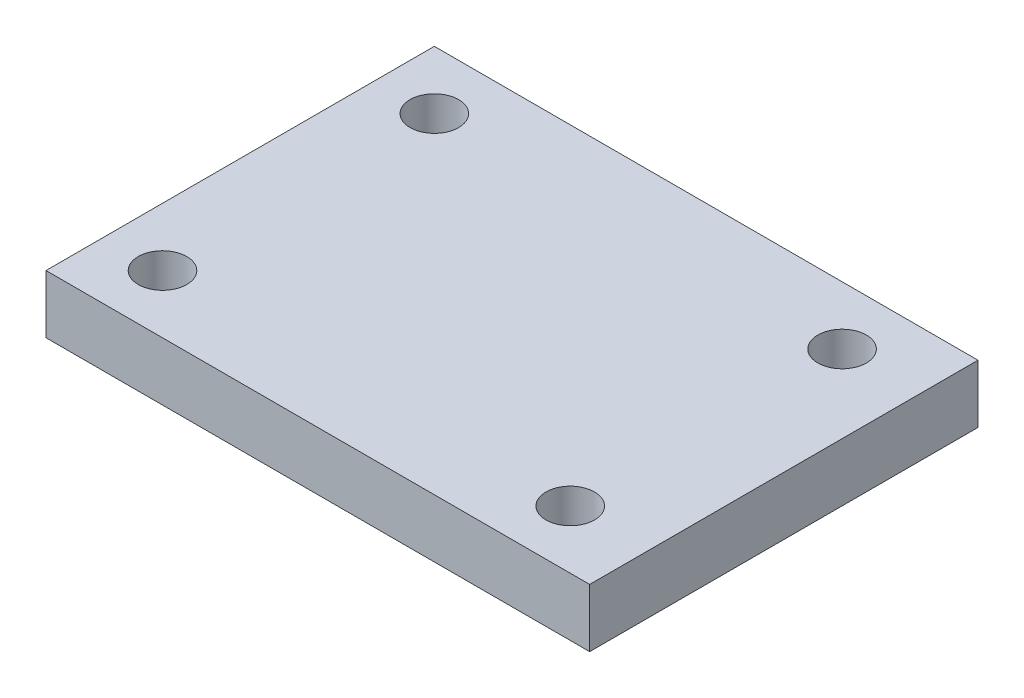
ISO-10303-21;
HEADER;
FILE_DESCRIPTION(('STEP AP214'),'2;1');
FILE_NAME('part.step','',(''),(''),'','','');
FILE_SCHEMA(('AUTOMOTIVE_DESIGN { 1 0 10303 214 1 1 1 1 }'));
ENDSEC;
DATA;
#1=APPLICATION_CONTEXT('core data for automotive mechanical design processes');
#2=APPLICATION_PROTOCOL_DEFINITION('international standard','automotive_design',2000,#1);
#3=PRODUCT_CONTEXT('',#1,'mechanical');
#4=PRODUCT('Part','Part','',(#3));
#5=PRODUCT_RELATED_PRODUCT_CATEGORY('part','',(#4));
#6=PRODUCT_DEFINITION_FORMATION('','',#4);
#7=PRODUCT_DEFINITION_CONTEXT('part definition',#1,'design');
#8=PRODUCT_DEFINITION('design','',#6,#7);
#9=PRODUCT_DEFINITION_SHAPE('','',#8);
#10=(LENGTH_UNIT() NAMED_UNIT(*) SI_UNIT(.MILLI.,.METRE.));
#11=(NAMED_UNIT(*) PLANE_ANGLE_UNIT() SI_UNIT($,.RADIAN.));
#12=(NAMED_UNIT(*) SI_UNIT($,.STERADIAN.) SOLID_ANGLE_UNIT());
#13=UNCERTAINTY_MEASURE_WITH_UNIT(LENGTH_MEASURE(1.E-05),#10,'distance_accuracy_value','');
#14=(GEOMETRIC_REPRESENTATION_CONTEXT(3) GLOBAL_UNCERTAINTY_ASSIGNED_CONTEXT((#13)) GLOBAL_UNIT_ASSIGNED_CONTEXT((#10,
#11,#12)) REPRESENTATION_CONTEXT('',''));
#15=CARTESIAN_POINT('',(0.,0.,0.));
#16=DIRECTION('',(0.,0.,1.));
#17=DIRECTION('',(1.,0.,0.));
#18=AXIS2_PLACEMENT_3D('',#15,#16,#17);
#19=CARTESIAN_POINT('',(14.,3.,-10.));
#20=DIRECTION('',(-1.,0.,0.));
#21=DIRECTION('',(0.,0.,1.));
#22=AXIS2_PLACEMENT_3D('',#19,#20,#21);
#23=PLANE('',#22);
#24=DIRECTION('',(0.,0.,-1.));
#25=VECTOR('',#24,1.);
#26=CARTESIAN_POINT('',(14.,0.,-10.));
#27=LINE('',#26,#25);
#28=CARTESIAN_POINT('',(14.,0.,10.));
#29=VERTEX_POINT('',#28);
#30=CARTESIAN_POINT('',(14.,0.,-10.));
#31=VERTEX_POINT('',#30);
#32=EDGE_CURVE('E111',#29,#31,#27,.T.);
#33=ORIENTED_EDGE('',*,*,#32,.T.);
#34=DIRECTION('',(0.,-1.,0.));
#35=VECTOR('',#34,1.);
#36=CARTESIAN_POINT('',(14.,3.,-10.));
#37=LINE('',#36,#35);
#38=CARTESIAN_POINT('',(14.,3.,-10.));
#39=VERTEX_POINT('',#38);
#40=EDGE_CURVE('E11',#39,#31,#37,.T.);
#41=ORIENTED_EDGE('',*,*,#40,.F.);
#42=DIRECTION('',(0.,0.,-1.));
#43=VECTOR('',#42,1.);
#44=CARTESIAN_POINT('',(14.,3.,-10.));
#45=LINE('',#44,#43);
#46=CARTESIAN_POINT('',(14.,3.,10.));
#47=VERTEX_POINT('',#46);
#48=EDGE_CURVE('E95',#47,#39,#45,.T.);
#49=ORIENTED_EDGE('',*,*,#48,.F.);
#50=DIRECTION('',(0.,-1.,0.));
#51=VECTOR('',#50,1.);
#52=CARTESIAN_POINT('',(14.,3.,10.));
#53=LINE('',#52,#51);
#54=EDGE_CURVE('E107',#47,#29,#53,.T.);
#55=ORIENTED_EDGE('',*,*,#54,.T.);
#56=EDGE_LOOP('',(#33,#41,#49,#55));
#57=FACE_BOUND('',#56,.T.);
#58=ADVANCED_FACE('F43',(#57),#23,.F.);
#59=CARTESIAN_POINT('',(-14.,3.,-10.));
#60=DIRECTION('',(0.,0.,1.));
#61=DIRECTION('',(1.,0.,0.));
#62=AXIS2_PLACEMENT_3D('',#59,#60,#61);
#63=PLANE('',#62);
#64=DIRECTION('',(-1.,0.,0.));
#65=VECTOR('',#64,1.);
#66=CARTESIAN_POINT('',(-14.,0.,-10.));
#67=LINE('',#66,#65);
#68=CARTESIAN_POINT('',(-14.,0.,-10.));
#69=VERTEX_POINT('',#68);
#70=EDGE_CURVE('E100',#31,#69,#67,.T.);
#71=ORIENTED_EDGE('',*,*,#70,.T.);
#72=DIRECTION('',(0.,-1.,0.));
#73=VECTOR('',#72,1.);
#74=CARTESIAN_POINT('',(-14.,3.,-10.));
#75=LINE('',#74,#73);
#76=CARTESIAN_POINT('',(-14.,3.,-10.));
#77=VERTEX_POINT('',#76);
#78=EDGE_CURVE('E52',#77,#69,#75,.T.);
#79=ORIENTED_EDGE('',*,*,#78,.F.);
#80=DIRECTION('',(-1.,0.,0.));
#81=VECTOR('',#80,1.);
#82=CARTESIAN_POINT('',(-14.,3.,-10.));
#83=LINE('',#82,#81);
#84=EDGE_CURVE('E90',#39,#77,#83,.T.);
#85=ORIENTED_EDGE('',*,*,#84,.F.);
#86=ORIENTED_EDGE('',*,*,#40,.T.);
#87=EDGE_LOOP('',(#71,#79,#85,#86));
#88=FACE_BOUND('',#87,.T.);
#89=ADVANCED_FACE('F99',(#88),#63,.F.);
#90=CARTESIAN_POINT('',(-14.,3.,-10.));
#91=DIRECTION('',(1.,0.,0.));
#92=DIRECTION('',(0.,0.,-1.));
#93=AXIS2_PLACEMENT_3D('',#90,#91,#92);
#94=PLANE('',#93);
#95=DIRECTION('',(0.,0.,1.));
#96=VECTOR('',#95,1.);
#97=CARTESIAN_POINT('',(-14.,0.,-10.));
#98=LINE('',#97,#96);
#99=CARTESIAN_POINT('',(-14.,0.,10.));
#100=VERTEX_POINT('',#99);
#101=EDGE_CURVE('E77',#69,#100,#98,.T.);
#102=ORIENTED_EDGE('',*,*,#101,.T.);
#103=DIRECTION('',(0.,-1.,0.));
#104=VECTOR('',#103,1.);
#105=CARTESIAN_POINT('',(-14.,3.,10.));
#106=LINE('',#105,#104);
#107=CARTESIAN_POINT('',(-14.,3.,10.));
#108=VERTEX_POINT('',#107);
#109=EDGE_CURVE('E102',#108,#100,#106,.T.);
#110=ORIENTED_EDGE('',*,*,#109,.F.);
#111=DIRECTION('',(0.,0.,1.));
#112=VECTOR('',#111,1.);
#113=CARTESIAN_POINT('',(-14.,3.,-10.));
#114=LINE('',#113,#112);
#115=EDGE_CURVE('E93',#77,#108,#114,.T.);
#116=ORIENTED_EDGE('',*,*,#115,.F.);
#117=ORIENTED_EDGE('',*,*,#78,.T.);
#118=EDGE_LOOP('',(#102,#110,#116,#117));
#119=FACE_BOUND('',#118,.T.);
#120=ADVANCED_FACE('F103',(#119),#94,.F.);
#121=CARTESIAN_POINT('',(-14.,3.,10.));
#122=DIRECTION('',(0.,0.,-1.));
#123=DIRECTION('',(-1.,0.,0.));
#124=AXIS2_PLACEMENT_3D('',#121,#122,#123);
#125=PLANE('',#124);
#126=DIRECTION('',(1.,0.,0.));
#127=VECTOR('',#126,1.);
#128=CARTESIAN_POINT('',(-14.,0.,10.));
#129=LINE('',#128,#127);
#130=EDGE_CURVE('E83',#100,#29,#129,.T.);
#131=ORIENTED_EDGE('',*,*,#130,.T.);
#132=ORIENTED_EDGE('',*,*,#54,.F.);
#133=DIRECTION('',(1.,0.,0.));
#134=VECTOR('',#133,1.);
#135=CARTESIAN_POINT('',(-14.,3.,10.));
#136=LINE('',#135,#134);
#137=EDGE_CURVE('E60',#108,#47,#136,.T.);
#138=ORIENTED_EDGE('',*,*,#137,.F.);
#139=ORIENTED_EDGE('',*,*,#109,.T.);
#140=EDGE_LOOP('',(#131,#132,#138,#139));
#141=FACE_BOUND('',#140,.T.);
#142=ADVANCED_FACE('F125',(#141),#125,.F.);
#143=CARTESIAN_POINT('',(0.,3.,0.));
#144=DIRECTION('',(0.,1.,0.));
#145=DIRECTION('',(0.,0.,1.));
#146=AXIS2_PLACEMENT_3D('',#143,#144,#145);
#147=PLANE('',#146);
#148=CARTESIAN_POINT('',(-11.,3.,-7.));
#149=DIRECTION('',(0.,1.,0.));
#150=DIRECTION('',(0.,0.,1.));
#151=AXIS2_PLACEMENT_3D('',#148,#149,#150);
#152=CIRCLE('',#151,1.25);
#153=CARTESIAN_POINT('',(-11.,3.,-5.75));
#154=VERTEX_POINT('',#153);
#155=EDGE_CURVE('E159',#154,#154,#152,.T.);
#156=ORIENTED_EDGE('',*,*,#155,.F.);
#157=EDGE_LOOP('',(#156));
#158=FACE_BOUND('',#157,.T.);
#159=CARTESIAN_POINT('',(-11.,3.,7.));
#160=DIRECTION('',(0.,1.,0.));
#161=DIRECTION('',(0.,0.,1.));
#162=AXIS2_PLACEMENT_3D('',#159,#160,#161);
#163=CIRCLE('',#162,1.25);
#164=CARTESIAN_POINT('',(-11.,3.,8.25));
#165=VERTEX_POINT('',#164);
#166=EDGE_CURVE('E151',#165,#165,#163,.T.);
#167=ORIENTED_EDGE('',*,*,#166,.F.);
#168=EDGE_LOOP('',(#167));
#169=FACE_BOUND('',#168,.T.);
#170=CARTESIAN_POINT('',(10.,3.,7.));
#171=DIRECTION('',(0.,1.,0.));
#172=DIRECTION('',(0.,0.,1.));
#173=AXIS2_PLACEMENT_3D('',#170,#171,#172);
#174=CIRCLE('',#173,1.25);
#175=CARTESIAN_POINT('',(10.,3.,8.25));
#176=VERTEX_POINT('',#175);
#177=EDGE_CURVE('E143',#176,#176,#174,.T.);
#178=ORIENTED_EDGE('',*,*,#177,.F.);
#179=EDGE_LOOP('',(#178));
#180=FACE_BOUND('',#179,.T.);
#181=CARTESIAN_POINT('',(10.,3.,-7.));
#182=DIRECTION('',(0.,1.,0.));
#183=DIRECTION('',(0.,0.,1.));
#184=AXIS2_PLACEMENT_3D('',#181,#182,#183);
#185=CIRCLE('',#184,1.25);
#186=CARTESIAN_POINT('',(10.,3.,-5.75));
#187=VERTEX_POINT('',#186);
#188=EDGE_CURVE('E135',#187,#187,#185,.T.);
#189=ORIENTED_EDGE('',*,*,#188,.F.);
#190=EDGE_LOOP('',(#189));
#191=FACE_BOUND('',#190,.T.);
#192=ORIENTED_EDGE('',*,*,#48,.T.);
#193=ORIENTED_EDGE('',*,*,#84,.T.);
#194=ORIENTED_EDGE('',*,*,#115,.T.);
#195=ORIENTED_EDGE('',*,*,#137,.T.);
#196=EDGE_LOOP('',(#192,#193,#194,#195));
#197=FACE_BOUND('',#196,.T.);
#198=ADVANCED_FACE('F91',(#158,#169,#180,#191,#197),#147,.T.);
#199=CARTESIAN_POINT('',(0.,0.,0.));
#200=DIRECTION('',(0.,1.,0.));
#201=DIRECTION('',(0.,0.,1.));
#202=AXIS2_PLACEMENT_3D('',#199,#200,#201);
#203=PLANE('',#202);
#204=CARTESIAN_POINT('',(-11.,0.,-7.));
#205=DIRECTION('',(0.,1.,0.));
#206=DIRECTION('',(0.,0.,1.));
#207=AXIS2_PLACEMENT_3D('',#204,#205,#206);
#208=CIRCLE('',#207,1.25);
#209=CARTESIAN_POINT('',(-11.,0.,-5.75));
#210=VERTEX_POINT('',#209);
#211=EDGE_CURVE('E155',#210,#210,#208,.T.);
#212=ORIENTED_EDGE('',*,*,#211,.T.);
#213=EDGE_LOOP('',(#212));
#214=FACE_BOUND('',#213,.T.);
#215=CARTESIAN_POINT('',(-11.,0.,7.));
#216=DIRECTION('',(0.,1.,0.));
#217=DIRECTION('',(0.,0.,1.));
#218=AXIS2_PLACEMENT_3D('',#215,#216,#217);
#219=CIRCLE('',#218,1.25);
#220=CARTESIAN_POINT('',(-11.,0.,8.25));
#221=VERTEX_POINT('',#220);
#222=EDGE_CURVE('E147',#221,#221,#219,.T.);
#223=ORIENTED_EDGE('',*,*,#222,.T.);
#224=EDGE_LOOP('',(#223));
#225=FACE_BOUND('',#224,.T.);
#226=CARTESIAN_POINT('',(10.,0.,7.));
#227=DIRECTION('',(0.,1.,0.));
#228=DIRECTION('',(0.,0.,1.));
#229=AXIS2_PLACEMENT_3D('',#226,#227,#228);
#230=CIRCLE('',#229,1.25);
#231=CARTESIAN_POINT('',(10.,0.,8.25));
#232=VERTEX_POINT('',#231);
#233=EDGE_CURVE('E139',#232,#232,#230,.T.);
#234=ORIENTED_EDGE('',*,*,#233,.T.);
#235=EDGE_LOOP('',(#234));
#236=FACE_BOUND('',#235,.T.);
#237=CARTESIAN_POINT('',(10.,0.,-7.));
#238=DIRECTION('',(0.,1.,0.));
#239=DIRECTION('',(0.,0.,1.));
#240=AXIS2_PLACEMENT_3D('',#237,#238,#239);
#241=CIRCLE('',#240,1.25);
#242=CARTESIAN_POINT('',(10.,0.,-5.75));
#243=VERTEX_POINT('',#242);
#244=EDGE_CURVE('E115',#243,#243,#241,.T.);
#245=ORIENTED_EDGE('',*,*,#244,.T.);
#246=EDGE_LOOP('',(#245));
#247=FACE_BOUND('',#246,.T.);
#248=ORIENTED_EDGE('',*,*,#32,.F.);
#249=ORIENTED_EDGE('',*,*,#130,.F.);
#250=ORIENTED_EDGE('',*,*,#101,.F.);
#251=ORIENTED_EDGE('',*,*,#70,.F.);
#252=EDGE_LOOP('',(#248,#249,#250,#251));
#253=FACE_BOUND('',#252,.T.);
#254=ADVANCED_FACE('F128',(#214,#225,#236,#247,#253),#203,.F.);
#255=CARTESIAN_POINT('',(10.,3.,-7.));
#256=DIRECTION('',(0.,1.,0.));
#257=DIRECTION('',(0.,0.,1.));
#258=AXIS2_PLACEMENT_3D('',#255,#256,#257);
#259=CYLINDRICAL_SURFACE('',#258,1.25);
#260=ORIENTED_EDGE('',*,*,#244,.F.);
#261=EDGE_LOOP('',(#260));
#262=FACE_BOUND('',#261,.T.);
#263=ORIENTED_EDGE('',*,*,#188,.T.);
#264=EDGE_LOOP('',(#263));
#265=FACE_BOUND('',#264,.T.);
#266=ADVANCED_FACE('F175',(#262,#265),#259,.F.);
#267=CARTESIAN_POINT('',(10.,3.,7.));
#268=DIRECTION('',(0.,1.,0.));
#269=DIRECTION('',(0.,0.,1.));
#270=AXIS2_PLACEMENT_3D('',#267,#268,#269);
#271=CYLINDRICAL_SURFACE('',#270,1.25);
#272=ORIENTED_EDGE('',*,*,#233,.F.);
#273=EDGE_LOOP('',(#272));
#274=FACE_BOUND('',#273,.T.);
#275=ORIENTED_EDGE('',*,*,#177,.T.);
#276=EDGE_LOOP('',(#275));
#277=FACE_BOUND('',#276,.T.);
#278=ADVANCED_FACE('F177',(#274,#277),#271,.F.);
#279=CARTESIAN_POINT('',(-11.,3.,7.));
#280=DIRECTION('',(0.,1.,0.));
#281=DIRECTION('',(0.,0.,1.));
#282=AXIS2_PLACEMENT_3D('',#279,#280,#281);
#283=CYLINDRICAL_SURFACE('',#282,1.25);
#284=ORIENTED_EDGE('',*,*,#222,.F.);
#285=EDGE_LOOP('',(#284));
#286=FACE_BOUND('',#285,.T.);
#287=ORIENTED_EDGE('',*,*,#166,.T.);
#288=EDGE_LOOP('',(#287));
#289=FACE_BOUND('',#288,.T.);
#290=ADVANCED_FACE('F184',(#286,#289),#283,.F.);
#291=CARTESIAN_POINT('',(-11.,3.,-7.));
#292=DIRECTION('',(0.,1.,0.));
#293=DIRECTION('',(0.,0.,1.));
#294=AXIS2_PLACEMENT_3D('',#291,#292,#293);
#295=CYLINDRICAL_SURFACE('',#294,1.25);
#296=ORIENTED_EDGE('',*,*,#211,.F.);
#297=EDGE_LOOP('',(#296));
#298=FACE_BOUND('',#297,.T.);
#299=ORIENTED_EDGE('',*,*,#155,.T.);
#300=EDGE_LOOP('',(#299));
#301=FACE_BOUND('',#300,.T.);
#302=ADVANCED_FACE('F164',(#298,#301),#295,.F.);
#303=CLOSED_SHELL('',(#58,#89,#120,#142,#198,#254,#266,#278,#290,#302));
#304=MANIFOLD_SOLID_BREP('B2',#303);
#305=ADVANCED_BREP_SHAPE_REPRESENTATION('',(#18,#304),#14);
#306=SHAPE_DEFINITION_REPRESENTATION(#9,#305);
ENDSEC;
END-ISO-10303-21;
